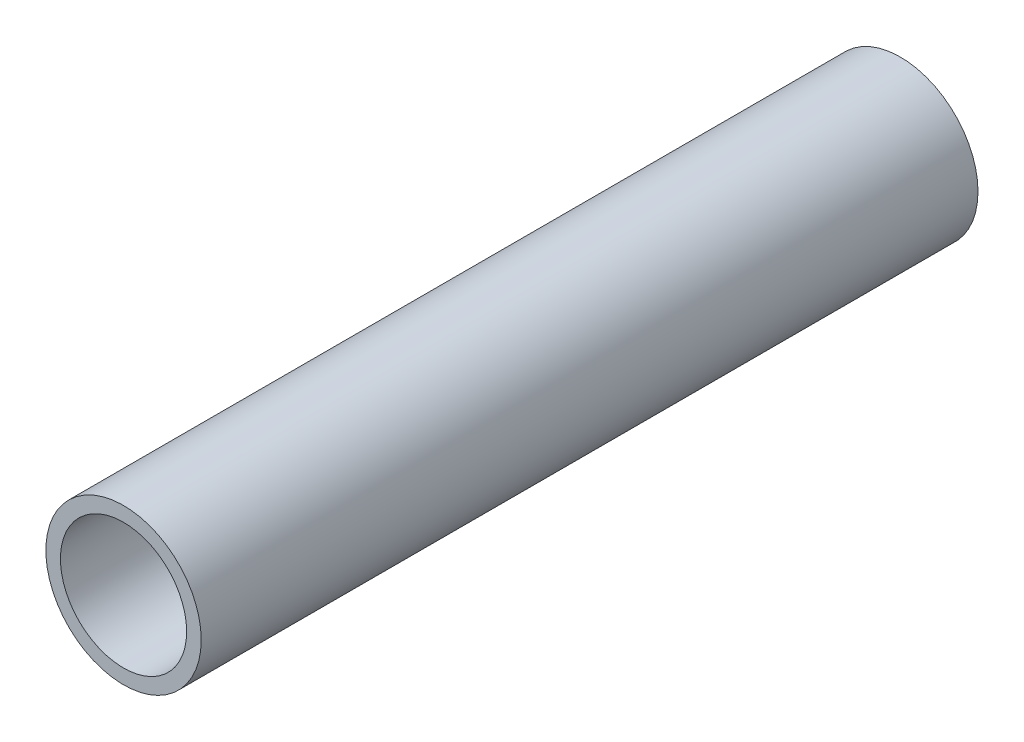
ISO-10303-21;
HEADER;
FILE_DESCRIPTION(('STEP AP214'),'2;1');
FILE_NAME('part.step','',(''),(''),'','','');
FILE_SCHEMA(('AUTOMOTIVE_DESIGN { 1 0 10303 214 1 1 1 1 }'));
ENDSEC;
DATA;
#1=APPLICATION_CONTEXT('core data for automotive mechanical design processes');
#2=APPLICATION_PROTOCOL_DEFINITION('international standard','automotive_design',2000,#1);
#3=PRODUCT_CONTEXT('',#1,'mechanical');
#4=PRODUCT('Part','Part','',(#3));
#5=PRODUCT_RELATED_PRODUCT_CATEGORY('part','',(#4));
#6=PRODUCT_DEFINITION_FORMATION('','',#4);
#7=PRODUCT_DEFINITION_CONTEXT('part definition',#1,'design');
#8=PRODUCT_DEFINITION('design','',#6,#7);
#9=PRODUCT_DEFINITION_SHAPE('','',#8);
#10=(LENGTH_UNIT() NAMED_UNIT(*) SI_UNIT(.MILLI.,.METRE.));
#11=(NAMED_UNIT(*) PLANE_ANGLE_UNIT() SI_UNIT($,.RADIAN.));
#12=(NAMED_UNIT(*) SI_UNIT($,.STERADIAN.) SOLID_ANGLE_UNIT());
#13=UNCERTAINTY_MEASURE_WITH_UNIT(LENGTH_MEASURE(1.E-05),#10,'distance_accuracy_value','');
#14=(GEOMETRIC_REPRESENTATION_CONTEXT(3) GLOBAL_UNCERTAINTY_ASSIGNED_CONTEXT((#13)) GLOBAL_UNIT_ASSIGNED_CONTEXT((#10,
#11,#12)) REPRESENTATION_CONTEXT('',''));
#15=CARTESIAN_POINT('',(0.,0.,0.));
#16=DIRECTION('',(0.,0.,1.));
#17=DIRECTION('',(1.,0.,0.));
#18=AXIS2_PLACEMENT_3D('',#15,#16,#17);
#19=CARTESIAN_POINT('',(0.,0.,80.));
#20=DIRECTION('',(0.,0.,-1.));
#21=DIRECTION('',(-1.,0.,0.));
#22=AXIS2_PLACEMENT_3D('',#19,#20,#21);
#23=CYLINDRICAL_SURFACE('',#22,16.);
#24=CARTESIAN_POINT('',(0.,0.,80.));
#25=DIRECTION('',(0.,0.,1.));
#26=DIRECTION('',(1.,0.,0.));
#27=AXIS2_PLACEMENT_3D('',#24,#25,#26);
#28=CIRCLE('',#27,16.);
#29=CARTESIAN_POINT('',(16.,0.,80.));
#30=VERTEX_POINT('',#29);
#31=EDGE_CURVE('E10',#30,#30,#28,.T.);
#32=ORIENTED_EDGE('',*,*,#31,.F.);
#33=EDGE_LOOP('',(#32));
#34=FACE_BOUND('',#33,.T.);
#35=CARTESIAN_POINT('',(0.,0.,-80.));
#36=DIRECTION('',(0.,0.,1.));
#37=DIRECTION('',(1.,0.,0.));
#38=AXIS2_PLACEMENT_3D('',#35,#36,#37);
#39=CIRCLE('',#38,16.);
#40=CARTESIAN_POINT('',(16.,0.,-80.));
#41=VERTEX_POINT('',#40);
#42=EDGE_CURVE('E35',#41,#41,#39,.T.);
#43=ORIENTED_EDGE('',*,*,#42,.T.);
#44=EDGE_LOOP('',(#43));
#45=FACE_BOUND('',#44,.T.);
#46=ADVANCED_FACE('F32',(#34,#45),#23,.T.);
#47=CARTESIAN_POINT('',(0.,0.,80.));
#48=DIRECTION('',(0.,0.,1.));
#49=DIRECTION('',(1.,0.,0.));
#50=AXIS2_PLACEMENT_3D('',#47,#48,#49);
#51=PLANE('',#50);
#52=CARTESIAN_POINT('',(0.,0.,80.));
#53=DIRECTION('',(0.,0.,1.));
#54=DIRECTION('',(1.,0.,0.));
#55=AXIS2_PLACEMENT_3D('',#52,#53,#54);
#56=CIRCLE('',#55,13.);
#57=CARTESIAN_POINT('',(13.,0.,80.));
#58=VERTEX_POINT('',#57);
#59=EDGE_CURVE('E42',#58,#58,#56,.T.);
#60=ORIENTED_EDGE('',*,*,#59,.F.);
#61=EDGE_LOOP('',(#60));
#62=FACE_BOUND('',#61,.T.);
#63=ORIENTED_EDGE('',*,*,#31,.T.);
#64=EDGE_LOOP('',(#63));
#65=FACE_BOUND('',#64,.T.);
#66=ADVANCED_FACE('F53',(#62,#65),#51,.T.);
#67=CARTESIAN_POINT('',(0.,0.,-80.));
#68=DIRECTION('',(0.,0.,1.));
#69=DIRECTION('',(1.,0.,0.));
#70=AXIS2_PLACEMENT_3D('',#67,#68,#69);
#71=PLANE('',#70);
#72=CARTESIAN_POINT('',(0.,0.,-80.));
#73=DIRECTION('',(0.,0.,1.));
#74=DIRECTION('',(1.,0.,0.));
#75=AXIS2_PLACEMENT_3D('',#72,#73,#74);
#76=CIRCLE('',#75,13.);
#77=CARTESIAN_POINT('',(13.,0.,-80.));
#78=VERTEX_POINT('',#77);
#79=EDGE_CURVE('E44',#78,#78,#76,.T.);
#80=ORIENTED_EDGE('',*,*,#79,.T.);
#81=EDGE_LOOP('',(#80));
#82=FACE_BOUND('',#81,.T.);
#83=ORIENTED_EDGE('',*,*,#42,.F.);
#84=EDGE_LOOP('',(#83));
#85=FACE_BOUND('',#84,.T.);
#86=ADVANCED_FACE('F55',(#82,#85),#71,.F.);
#87=CARTESIAN_POINT('',(0.,0.,80.));
#88=DIRECTION('',(0.,0.,-1.));
#89=DIRECTION('',(-1.,0.,0.));
#90=AXIS2_PLACEMENT_3D('',#87,#88,#89);
#91=CYLINDRICAL_SURFACE('',#90,13.);
#92=ORIENTED_EDGE('',*,*,#59,.T.);
#93=EDGE_LOOP('',(#92));
#94=FACE_BOUND('',#93,.T.);
#95=ORIENTED_EDGE('',*,*,#79,.F.);
#96=EDGE_LOOP('',(#95));
#97=FACE_BOUND('',#96,.T.);
#98=ADVANCED_FACE('F50',(#94,#97),#91,.F.);
#99=CLOSED_SHELL('',(#46,#66,#86,#98));
#100=MANIFOLD_SOLID_BREP('B2',#99);
#101=ADVANCED_BREP_SHAPE_REPRESENTATION('',(#18,#100),#14);
#102=SHAPE_DEFINITION_REPRESENTATION(#9,#101);
ENDSEC;
END-ISO-10303-21;
